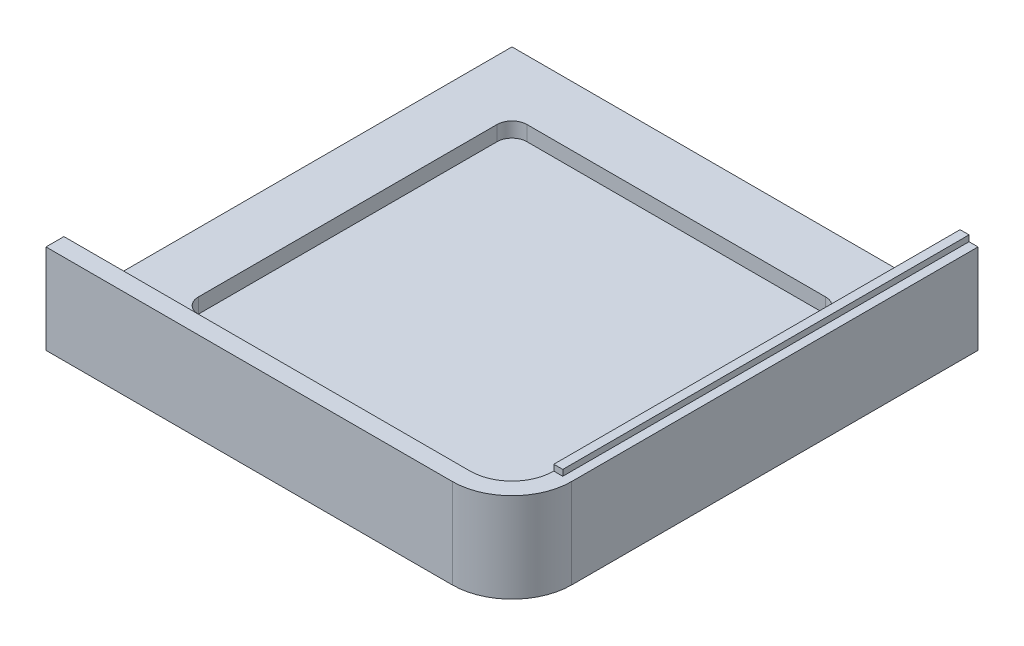
ISO-10303-21;
HEADER;
FILE_DESCRIPTION(('STEP AP214'),'2;1');
FILE_NAME('part.step','',(''),(''),'','','');
FILE_SCHEMA(('AUTOMOTIVE_DESIGN { 1 0 10303 214 1 1 1 1 }'));
ENDSEC;
DATA;
#1=APPLICATION_CONTEXT('core data for automotive mechanical design processes');
#2=APPLICATION_PROTOCOL_DEFINITION('international standard','automotive_design',2000,#1);
#3=PRODUCT_CONTEXT('',#1,'mechanical');
#4=PRODUCT('Part','Part','',(#3));
#5=PRODUCT_RELATED_PRODUCT_CATEGORY('part','',(#4));
#6=PRODUCT_DEFINITION_FORMATION('','',#4);
#7=PRODUCT_DEFINITION_CONTEXT('part definition',#1,'design');
#8=PRODUCT_DEFINITION('design','',#6,#7);
#9=PRODUCT_DEFINITION_SHAPE('','',#8);
#10=(LENGTH_UNIT() NAMED_UNIT(*) SI_UNIT(.MILLI.,.METRE.));
#11=(NAMED_UNIT(*) PLANE_ANGLE_UNIT() SI_UNIT($,.RADIAN.));
#12=(NAMED_UNIT(*) SI_UNIT($,.STERADIAN.) SOLID_ANGLE_UNIT());
#13=UNCERTAINTY_MEASURE_WITH_UNIT(LENGTH_MEASURE(1.E-05),#10,'distance_accuracy_value','');
#14=(GEOMETRIC_REPRESENTATION_CONTEXT(3) GLOBAL_UNCERTAINTY_ASSIGNED_CONTEXT((#13)) GLOBAL_UNIT_ASSIGNED_CONTEXT((#10,
#11,#12)) REPRESENTATION_CONTEXT('',''));
#15=CARTESIAN_POINT('',(0.,0.,0.));
#16=DIRECTION('',(0.,0.,1.));
#17=DIRECTION('',(1.,0.,0.));
#18=AXIS2_PLACEMENT_3D('',#15,#16,#17);
#19=CARTESIAN_POINT('',(0.,5.,0.));
#20=DIRECTION('',(0.,1.,0.));
#21=DIRECTION('',(0.,0.,1.));
#22=AXIS2_PLACEMENT_3D('',#19,#20,#21);
#23=PLANE('',#22);
#24=DIRECTION('',(-1.,0.,0.));
#25=VECTOR('',#24,1.);
#26=CARTESIAN_POINT('',(150.,5.,-6.00000000000002));
#27=LINE('',#26,#25);
#28=CARTESIAN_POINT('',(136.,5.,-6.00000000000002));
#29=VERTEX_POINT('',#28);
#30=CARTESIAN_POINT('',(0.,5.,-6.00000000000001));
#31=VERTEX_POINT('',#30);
#32=EDGE_CURVE('E211',#29,#31,#27,.T.);
#33=ORIENTED_EDGE('',*,*,#32,.F.);
#34=CARTESIAN_POINT('',(136.,5.,-20.));
#35=DIRECTION('',(0.,1.,0.));
#36=DIRECTION('',(0.,0.,1.));
#37=AXIS2_PLACEMENT_3D('',#34,#35,#36);
#38=CIRCLE('',#37,14.);
#39=CARTESIAN_POINT('',(150.,5.,-20.));
#40=VERTEX_POINT('',#39);
#41=EDGE_CURVE('E236',#29,#40,#38,.T.);
#42=ORIENTED_EDGE('',*,*,#41,.T.);
#43=DIRECTION('',(0.,0.,1.));
#44=VECTOR('',#43,1.);
#45=CARTESIAN_POINT('',(150.,5.,-156.));
#46=LINE('',#45,#44);
#47=CARTESIAN_POINT('',(150.,5.,-156.));
#48=VERTEX_POINT('',#47);
#49=EDGE_CURVE('E209',#48,#40,#46,.T.);
#50=ORIENTED_EDGE('',*,*,#49,.F.);
#51=DIRECTION('',(-1.,0.,0.));
#52=VECTOR('',#51,1.);
#53=CARTESIAN_POINT('',(0.,5.,-156.));
#54=LINE('',#53,#52);
#55=CARTESIAN_POINT('',(0.,5.,-156.));
#56=VERTEX_POINT('',#55);
#57=EDGE_CURVE('E173',#48,#56,#54,.T.);
#58=ORIENTED_EDGE('',*,*,#57,.T.);
#59=DIRECTION('',(0.,0.,1.));
#60=VECTOR('',#59,1.);
#61=CARTESIAN_POINT('',(0.,5.,-156.));
#62=LINE('',#61,#60);
#63=EDGE_CURVE('E284',#56,#31,#62,.T.);
#64=ORIENTED_EDGE('',*,*,#63,.T.);
#65=EDGE_LOOP('',(#33,#42,#50,#58,#64));
#66=FACE_BOUND('',#65,.T.);
#67=DIRECTION('',(1.,0.,0.));
#68=VECTOR('',#67,1.);
#69=CARTESIAN_POINT('',(20.,5.,-26.));
#70=LINE('',#69,#68);
#71=CARTESIAN_POINT('',(25.,5.,-26.));
#72=VERTEX_POINT('',#71);
#73=CARTESIAN_POINT('',(125.,5.,-26.));
#74=VERTEX_POINT('',#73);
#75=EDGE_CURVE('E360',#72,#74,#70,.T.);
#76=ORIENTED_EDGE('',*,*,#75,.F.);
#77=CARTESIAN_POINT('',(25.,5.,-31.));
#78=DIRECTION('',(0.,1.,0.));
#79=DIRECTION('',(0.,0.,1.));
#80=AXIS2_PLACEMENT_3D('',#77,#78,#79);
#81=CIRCLE('',#80,5.);
#82=CARTESIAN_POINT('',(20.,5.,-31.));
#83=VERTEX_POINT('',#82);
#84=EDGE_CURVE('E323',#72,#83,#81,.F.);
#85=ORIENTED_EDGE('',*,*,#84,.T.);
#86=DIRECTION('',(0.,0.,1.));
#87=VECTOR('',#86,1.);
#88=CARTESIAN_POINT('',(20.,5.,-136.));
#89=LINE('',#88,#87);
#90=CARTESIAN_POINT('',(20.,5.,-131.));
#91=VERTEX_POINT('',#90);
#92=EDGE_CURVE('E341',#91,#83,#89,.T.);
#93=ORIENTED_EDGE('',*,*,#92,.F.);
#94=CARTESIAN_POINT('',(25.,5.,-131.));
#95=DIRECTION('',(0.,1.,0.));
#96=DIRECTION('',(0.,0.,1.));
#97=AXIS2_PLACEMENT_3D('',#94,#95,#96);
#98=CIRCLE('',#97,5.);
#99=CARTESIAN_POINT('',(25.,5.,-136.));
#100=VERTEX_POINT('',#99);
#101=EDGE_CURVE('E274',#91,#100,#98,.F.);
#102=ORIENTED_EDGE('',*,*,#101,.T.);
#103=DIRECTION('',(-1.,0.,0.));
#104=VECTOR('',#103,1.);
#105=CARTESIAN_POINT('',(20.,5.,-136.));
#106=LINE('',#105,#104);
#107=CARTESIAN_POINT('',(125.,5.,-136.));
#108=VERTEX_POINT('',#107);
#109=EDGE_CURVE('E338',#108,#100,#106,.T.);
#110=ORIENTED_EDGE('',*,*,#109,.F.);
#111=CARTESIAN_POINT('',(125.,5.,-131.));
#112=DIRECTION('',(0.,1.,0.));
#113=DIRECTION('',(0.,0.,1.));
#114=AXIS2_PLACEMENT_3D('',#111,#112,#113);
#115=CIRCLE('',#114,5.);
#116=CARTESIAN_POINT('',(130.,5.,-131.));
#117=VERTEX_POINT('',#116);
#118=EDGE_CURVE('E328',#108,#117,#115,.F.);
#119=ORIENTED_EDGE('',*,*,#118,.T.);
#120=DIRECTION('',(0.,0.,-1.));
#121=VECTOR('',#120,1.);
#122=CARTESIAN_POINT('',(130.,5.,-136.));
#123=LINE('',#122,#121);
#124=CARTESIAN_POINT('',(130.,5.,-31.));
#125=VERTEX_POINT('',#124);
#126=EDGE_CURVE('E348',#125,#117,#123,.T.);
#127=ORIENTED_EDGE('',*,*,#126,.F.);
#128=CARTESIAN_POINT('',(125.,5.,-31.));
#129=DIRECTION('',(0.,1.,0.));
#130=DIRECTION('',(0.,0.,1.));
#131=AXIS2_PLACEMENT_3D('',#128,#129,#130);
#132=CIRCLE('',#131,5.);
#133=EDGE_CURVE('E318',#125,#74,#132,.F.);
#134=ORIENTED_EDGE('',*,*,#133,.T.);
#135=EDGE_LOOP('',(#76,#85,#93,#102,#110,#119,#127,#134));
#136=FACE_BOUND('',#135,.T.);
#137=ADVANCED_FACE('F31',(#66,#136),#23,.T.);
#138=CARTESIAN_POINT('',(0.,5.,-156.));
#139=DIRECTION('',(1.,0.,0.));
#140=DIRECTION('',(0.,0.,-1.));
#141=AXIS2_PLACEMENT_3D('',#138,#139,#140);
#142=PLANE('',#141);
#143=DIRECTION('',(0.,-1.,0.));
#144=VECTOR('',#143,1.);
#145=CARTESIAN_POINT('',(0.,5.,-156.));
#146=LINE('',#145,#144);
#147=CARTESIAN_POINT('',(0.,-5.,-156.));
#148=VERTEX_POINT('',#147);
#149=EDGE_CURVE('E283',#56,#148,#146,.T.);
#150=ORIENTED_EDGE('',*,*,#149,.T.);
#151=DIRECTION('',(0.,0.,-1.));
#152=VECTOR('',#151,1.);
#153=CARTESIAN_POINT('',(0.,-5.,0.));
#154=LINE('',#153,#152);
#155=CARTESIAN_POINT('',(0.,-5.,0.));
#156=VERTEX_POINT('',#155);
#157=EDGE_CURVE('E176',#156,#148,#154,.T.);
#158=ORIENTED_EDGE('',*,*,#157,.F.);
#159=DIRECTION('',(0.,-1.,0.));
#160=VECTOR('',#159,1.);
#161=CARTESIAN_POINT('',(0.,5.,0.));
#162=LINE('',#161,#160);
#163=CARTESIAN_POINT('',(0.,25.,0.));
#164=VERTEX_POINT('',#163);
#165=EDGE_CURVE('E257',#164,#156,#162,.T.);
#166=ORIENTED_EDGE('',*,*,#165,.F.);
#167=DIRECTION('',(0.,0.,1.));
#168=VECTOR('',#167,1.);
#169=CARTESIAN_POINT('',(0.,25.,-6.00000000000001));
#170=LINE('',#169,#168);
#171=CARTESIAN_POINT('',(0.,25.,-6.00000000000001));
#172=VERTEX_POINT('',#171);
#173=EDGE_CURVE('E214',#172,#164,#170,.T.);
#174=ORIENTED_EDGE('',*,*,#173,.F.);
#175=DIRECTION('',(0.,-1.,0.));
#176=VECTOR('',#175,1.);
#177=CARTESIAN_POINT('',(0.,25.,-6.00000000000001));
#178=LINE('',#177,#176);
#179=EDGE_CURVE('E177',#172,#31,#178,.T.);
#180=ORIENTED_EDGE('',*,*,#179,.T.);
#181=ORIENTED_EDGE('',*,*,#63,.F.);
#182=EDGE_LOOP('',(#150,#158,#166,#174,#180,#181));
#183=FACE_BOUND('',#182,.T.);
#184=ADVANCED_FACE('F254',(#183),#142,.F.);
#185=CARTESIAN_POINT('',(0.,5.,0.));
#186=DIRECTION('',(0.,0.,-1.));
#187=DIRECTION('',(-1.,0.,0.));
#188=AXIS2_PLACEMENT_3D('',#185,#186,#187);
#189=PLANE('',#188);
#190=DIRECTION('',(-1.,0.,0.));
#191=VECTOR('',#190,1.);
#192=CARTESIAN_POINT('',(0.,-5.,0.));
#193=LINE('',#192,#191);
#194=CARTESIAN_POINT('',(136.,-5.,0.));
#195=VERTEX_POINT('',#194);
#196=EDGE_CURVE('E366',#195,#156,#193,.T.);
#197=ORIENTED_EDGE('',*,*,#196,.F.);
#198=DIRECTION('',(0.,-1.,0.));
#199=VECTOR('',#198,1.);
#200=CARTESIAN_POINT('',(136.,5.,0.));
#201=LINE('',#200,#199);
#202=CARTESIAN_POINT('',(136.,25.,0.));
#203=VERTEX_POINT('',#202);
#204=EDGE_CURVE('E266',#195,#203,#201,.F.);
#205=ORIENTED_EDGE('',*,*,#204,.T.);
#206=DIRECTION('',(1.,0.,0.));
#207=VECTOR('',#206,1.);
#208=CARTESIAN_POINT('',(0.,25.,0.));
#209=LINE('',#208,#207);
#210=EDGE_CURVE('E217',#164,#203,#209,.T.);
#211=ORIENTED_EDGE('',*,*,#210,.F.);
#212=ORIENTED_EDGE('',*,*,#165,.T.);
#213=EDGE_LOOP('',(#197,#205,#211,#212));
#214=FACE_BOUND('',#213,.T.);
#215=ADVANCED_FACE('F385',(#214),#189,.F.);
#216=CARTESIAN_POINT('',(156.,5.,-156.));
#217=DIRECTION('',(-1.,0.,0.));
#218=DIRECTION('',(0.,0.,1.));
#219=AXIS2_PLACEMENT_3D('',#216,#217,#218);
#220=PLANE('',#219);
#221=DIRECTION('',(0.,0.,-1.));
#222=VECTOR('',#221,1.);
#223=CARTESIAN_POINT('',(156.,25.,0.));
#224=LINE('',#223,#222);
#225=CARTESIAN_POINT('',(156.,25.,-20.));
#226=VERTEX_POINT('',#225);
#227=CARTESIAN_POINT('',(156.,25.,-156.));
#228=VERTEX_POINT('',#227);
#229=EDGE_CURVE('E220',#226,#228,#224,.T.);
#230=ORIENTED_EDGE('',*,*,#229,.F.);
#231=DIRECTION('',(0.,-1.,0.));
#232=VECTOR('',#231,1.);
#233=CARTESIAN_POINT('',(156.,5.,-20.));
#234=LINE('',#233,#232);
#235=CARTESIAN_POINT('',(156.,-5.,-20.));
#236=VERTEX_POINT('',#235);
#237=EDGE_CURVE('E268',#226,#236,#234,.T.);
#238=ORIENTED_EDGE('',*,*,#237,.T.);
#239=DIRECTION('',(0.,0.,1.));
#240=VECTOR('',#239,1.);
#241=CARTESIAN_POINT('',(156.,-5.,0.));
#242=LINE('',#241,#240);
#243=CARTESIAN_POINT('',(156.,-5.,-156.));
#244=VERTEX_POINT('',#243);
#245=EDGE_CURVE('E373',#244,#236,#242,.T.);
#246=ORIENTED_EDGE('',*,*,#245,.F.);
#247=DIRECTION('',(0.,-1.,0.));
#248=VECTOR('',#247,1.);
#249=CARTESIAN_POINT('',(156.,5.,-156.));
#250=LINE('',#249,#248);
#251=EDGE_CURVE('E292',#228,#244,#250,.T.);
#252=ORIENTED_EDGE('',*,*,#251,.F.);
#253=EDGE_LOOP('',(#230,#238,#246,#252));
#254=FACE_BOUND('',#253,.T.);
#255=ADVANCED_FACE('F384',(#254),#220,.F.);
#256=CARTESIAN_POINT('',(0.,5.,-156.));
#257=DIRECTION('',(0.,0.,1.));
#258=DIRECTION('',(1.,0.,0.));
#259=AXIS2_PLACEMENT_3D('',#256,#257,#258);
#260=PLANE('',#259);
#261=ORIENTED_EDGE('',*,*,#251,.T.);
#262=DIRECTION('',(1.,0.,0.));
#263=VECTOR('',#262,1.);
#264=CARTESIAN_POINT('',(0.,-5.,-156.));
#265=LINE('',#264,#263);
#266=EDGE_CURVE('E375',#148,#244,#265,.T.);
#267=ORIENTED_EDGE('',*,*,#266,.F.);
#268=ORIENTED_EDGE('',*,*,#149,.F.);
#269=ORIENTED_EDGE('',*,*,#57,.F.);
#270=DIRECTION('',(0.,-1.,0.));
#271=VECTOR('',#270,1.);
#272=CARTESIAN_POINT('',(150.,25.,-156.));
#273=LINE('',#272,#271);
#274=CARTESIAN_POINT('',(150.,27.,-156.));
#275=VERTEX_POINT('',#274);
#276=EDGE_CURVE('E166',#275,#48,#273,.T.);
#277=ORIENTED_EDGE('',*,*,#276,.F.);
#278=DIRECTION('',(-1.,0.,0.));
#279=VECTOR('',#278,1.);
#280=CARTESIAN_POINT('',(150.,27.,-156.));
#281=LINE('',#280,#279);
#282=CARTESIAN_POINT('',(153.,27.,-156.));
#283=VERTEX_POINT('',#282);
#284=EDGE_CURVE('E171',#283,#275,#281,.T.);
#285=ORIENTED_EDGE('',*,*,#284,.F.);
#286=DIRECTION('',(0.,-1.,0.));
#287=VECTOR('',#286,1.);
#288=CARTESIAN_POINT('',(153.,27.,-156.));
#289=LINE('',#288,#287);
#290=CARTESIAN_POINT('',(153.,25.,-156.));
#291=VERTEX_POINT('',#290);
#292=EDGE_CURVE('E198',#283,#291,#289,.T.);
#293=ORIENTED_EDGE('',*,*,#292,.T.);
#294=DIRECTION('',(-1.,0.,0.));
#295=VECTOR('',#294,1.);
#296=CARTESIAN_POINT('',(156.,25.,-156.));
#297=LINE('',#296,#295);
#298=EDGE_CURVE('E48',#228,#291,#297,.T.);
#299=ORIENTED_EDGE('',*,*,#298,.F.);
#300=EDGE_LOOP('',(#261,#267,#268,#269,#277,#285,#293,#299));
#301=FACE_BOUND('',#300,.T.);
#302=ADVANCED_FACE('F168',(#301),#260,.F.);
#303=CARTESIAN_POINT('',(20.,5.,-136.));
#304=DIRECTION('',(1.,0.,0.));
#305=DIRECTION('',(0.,0.,-1.));
#306=AXIS2_PLACEMENT_3D('',#303,#304,#305);
#307=PLANE('',#306);
#308=ORIENTED_EDGE('',*,*,#92,.T.);
#309=DIRECTION('',(0.,-1.,0.));
#310=VECTOR('',#309,1.);
#311=CARTESIAN_POINT('',(20.,0.,-31.));
#312=LINE('',#311,#310);
#313=CARTESIAN_POINT('',(20.,0.,-31.));
#314=VERTEX_POINT('',#313);
#315=EDGE_CURVE('E307',#83,#314,#312,.T.);
#316=ORIENTED_EDGE('',*,*,#315,.T.);
#317=DIRECTION('',(0.,0.,1.));
#318=VECTOR('',#317,1.);
#319=CARTESIAN_POINT('',(20.,0.,-136.));
#320=LINE('',#319,#318);
#321=CARTESIAN_POINT('',(20.,0.,-131.));
#322=VERTEX_POINT('',#321);
#323=EDGE_CURVE('E356',#322,#314,#320,.T.);
#324=ORIENTED_EDGE('',*,*,#323,.F.);
#325=DIRECTION('',(0.,-1.,0.));
#326=VECTOR('',#325,1.);
#327=CARTESIAN_POINT('',(20.,5.,-131.));
#328=LINE('',#327,#326);
#329=EDGE_CURVE('E305',#322,#91,#328,.F.);
#330=ORIENTED_EDGE('',*,*,#329,.T.);
#331=EDGE_LOOP('',(#308,#316,#324,#330));
#332=FACE_BOUND('',#331,.T.);
#333=ADVANCED_FACE('F401',(#332),#307,.T.);
#334=CARTESIAN_POINT('',(20.,5.,-26.));
#335=DIRECTION('',(0.,0.,-1.));
#336=DIRECTION('',(-1.,0.,0.));
#337=AXIS2_PLACEMENT_3D('',#334,#335,#336);
#338=PLANE('',#337);
#339=ORIENTED_EDGE('',*,*,#75,.T.);
#340=DIRECTION('',(0.,-1.,0.));
#341=VECTOR('',#340,1.);
#342=CARTESIAN_POINT('',(125.,0.,-26.));
#343=LINE('',#342,#341);
#344=CARTESIAN_POINT('',(125.,0.,-26.));
#345=VERTEX_POINT('',#344);
#346=EDGE_CURVE('E297',#74,#345,#343,.T.);
#347=ORIENTED_EDGE('',*,*,#346,.T.);
#348=DIRECTION('',(1.,0.,0.));
#349=VECTOR('',#348,1.);
#350=CARTESIAN_POINT('',(20.,0.,-26.));
#351=LINE('',#350,#349);
#352=CARTESIAN_POINT('',(25.,0.,-26.));
#353=VERTEX_POINT('',#352);
#354=EDGE_CURVE('E362',#353,#345,#351,.T.);
#355=ORIENTED_EDGE('',*,*,#354,.F.);
#356=DIRECTION('',(0.,-1.,0.));
#357=VECTOR('',#356,1.);
#358=CARTESIAN_POINT('',(25.,5.,-26.));
#359=LINE('',#358,#357);
#360=EDGE_CURVE('E295',#353,#72,#359,.F.);
#361=ORIENTED_EDGE('',*,*,#360,.T.);
#362=EDGE_LOOP('',(#339,#347,#355,#361));
#363=FACE_BOUND('',#362,.T.);
#364=ADVANCED_FACE('F407',(#363),#338,.T.);
#365=CARTESIAN_POINT('',(130.,5.,-136.));
#366=DIRECTION('',(-1.,0.,0.));
#367=DIRECTION('',(0.,0.,1.));
#368=AXIS2_PLACEMENT_3D('',#365,#366,#367);
#369=PLANE('',#368);
#370=DIRECTION('',(0.,0.,-1.));
#371=VECTOR('',#370,1.);
#372=CARTESIAN_POINT('',(130.,0.,-136.));
#373=LINE('',#372,#371);
#374=CARTESIAN_POINT('',(130.,0.,-31.));
#375=VERTEX_POINT('',#374);
#376=CARTESIAN_POINT('',(130.,0.,-131.));
#377=VERTEX_POINT('',#376);
#378=EDGE_CURVE('E359',#375,#377,#373,.T.);
#379=ORIENTED_EDGE('',*,*,#378,.F.);
#380=DIRECTION('',(0.,-1.,0.));
#381=VECTOR('',#380,1.);
#382=CARTESIAN_POINT('',(130.,5.,-31.));
#383=LINE('',#382,#381);
#384=EDGE_CURVE('E303',#375,#125,#383,.F.);
#385=ORIENTED_EDGE('',*,*,#384,.T.);
#386=ORIENTED_EDGE('',*,*,#126,.T.);
#387=DIRECTION('',(0.,-1.,0.));
#388=VECTOR('',#387,1.);
#389=CARTESIAN_POINT('',(130.,0.,-131.));
#390=LINE('',#389,#388);
#391=EDGE_CURVE('E300',#117,#377,#390,.T.);
#392=ORIENTED_EDGE('',*,*,#391,.T.);
#393=EDGE_LOOP('',(#379,#385,#386,#392));
#394=FACE_BOUND('',#393,.T.);
#395=ADVANCED_FACE('F412',(#394),#369,.T.);
#396=CARTESIAN_POINT('',(20.,5.,-136.));
#397=DIRECTION('',(0.,0.,1.));
#398=DIRECTION('',(1.,0.,0.));
#399=AXIS2_PLACEMENT_3D('',#396,#397,#398);
#400=PLANE('',#399);
#401=DIRECTION('',(-1.,0.,0.));
#402=VECTOR('',#401,1.);
#403=CARTESIAN_POINT('',(20.,0.,-136.));
#404=LINE('',#403,#402);
#405=CARTESIAN_POINT('',(125.,0.,-136.));
#406=VERTEX_POINT('',#405);
#407=CARTESIAN_POINT('',(25.,0.,-136.));
#408=VERTEX_POINT('',#407);
#409=EDGE_CURVE('E357',#406,#408,#404,.T.);
#410=ORIENTED_EDGE('',*,*,#409,.F.);
#411=DIRECTION('',(0.,-1.,0.));
#412=VECTOR('',#411,1.);
#413=CARTESIAN_POINT('',(125.,5.,-136.));
#414=LINE('',#413,#412);
#415=EDGE_CURVE('E313',#406,#108,#414,.F.);
#416=ORIENTED_EDGE('',*,*,#415,.T.);
#417=ORIENTED_EDGE('',*,*,#109,.T.);
#418=DIRECTION('',(0.,-1.,0.));
#419=VECTOR('',#418,1.);
#420=CARTESIAN_POINT('',(25.,0.,-136.));
#421=LINE('',#420,#419);
#422=EDGE_CURVE('E310',#100,#408,#421,.T.);
#423=ORIENTED_EDGE('',*,*,#422,.T.);
#424=EDGE_LOOP('',(#410,#416,#417,#423));
#425=FACE_BOUND('',#424,.T.);
#426=ADVANCED_FACE('F345',(#425),#400,.T.);
#427=CARTESIAN_POINT('',(125.,5.,-31.));
#428=DIRECTION('',(0.,1.,0.));
#429=DIRECTION('',(0.,0.,1.));
#430=AXIS2_PLACEMENT_3D('',#427,#428,#429);
#431=CYLINDRICAL_SURFACE('',#430,5.);
#432=ORIENTED_EDGE('',*,*,#133,.F.);
#433=ORIENTED_EDGE('',*,*,#384,.F.);
#434=CARTESIAN_POINT('',(125.,0.,-31.));
#435=DIRECTION('',(0.,1.,0.));
#436=DIRECTION('',(0.,0.,1.));
#437=AXIS2_PLACEMENT_3D('',#434,#435,#436);
#438=CIRCLE('',#437,5.);
#439=EDGE_CURVE('E315',#345,#375,#438,.T.);
#440=ORIENTED_EDGE('',*,*,#439,.F.);
#441=ORIENTED_EDGE('',*,*,#346,.F.);
#442=EDGE_LOOP('',(#432,#433,#440,#441));
#443=FACE_BOUND('',#442,.T.);
#444=ADVANCED_FACE('F422',(#443),#431,.F.);
#445=CARTESIAN_POINT('',(25.,5.,-31.));
#446=DIRECTION('',(0.,1.,0.));
#447=DIRECTION('',(0.,0.,1.));
#448=AXIS2_PLACEMENT_3D('',#445,#446,#447);
#449=CYLINDRICAL_SURFACE('',#448,5.);
#450=ORIENTED_EDGE('',*,*,#84,.F.);
#451=ORIENTED_EDGE('',*,*,#360,.F.);
#452=CARTESIAN_POINT('',(25.,0.,-31.));
#453=DIRECTION('',(0.,1.,0.));
#454=DIRECTION('',(0.,0.,1.));
#455=AXIS2_PLACEMENT_3D('',#452,#453,#454);
#456=CIRCLE('',#455,5.);
#457=EDGE_CURVE('E320',#314,#353,#456,.T.);
#458=ORIENTED_EDGE('',*,*,#457,.F.);
#459=ORIENTED_EDGE('',*,*,#315,.F.);
#460=EDGE_LOOP('',(#450,#451,#458,#459));
#461=FACE_BOUND('',#460,.T.);
#462=ADVANCED_FACE('F417',(#461),#449,.F.);
#463=CARTESIAN_POINT('',(125.,5.,-131.));
#464=DIRECTION('',(0.,1.,0.));
#465=DIRECTION('',(0.,0.,1.));
#466=AXIS2_PLACEMENT_3D('',#463,#464,#465);
#467=CYLINDRICAL_SURFACE('',#466,5.);
#468=ORIENTED_EDGE('',*,*,#118,.F.);
#469=ORIENTED_EDGE('',*,*,#415,.F.);
#470=CARTESIAN_POINT('',(125.,0.,-131.));
#471=DIRECTION('',(0.,1.,0.));
#472=DIRECTION('',(0.,0.,1.));
#473=AXIS2_PLACEMENT_3D('',#470,#471,#472);
#474=CIRCLE('',#473,5.);
#475=EDGE_CURVE('E325',#377,#406,#474,.T.);
#476=ORIENTED_EDGE('',*,*,#475,.F.);
#477=ORIENTED_EDGE('',*,*,#391,.F.);
#478=EDGE_LOOP('',(#468,#469,#476,#477));
#479=FACE_BOUND('',#478,.T.);
#480=ADVANCED_FACE('F428',(#479),#467,.F.);
#481=CARTESIAN_POINT('',(25.,5.,-131.));
#482=DIRECTION('',(0.,1.,0.));
#483=DIRECTION('',(0.,0.,1.));
#484=AXIS2_PLACEMENT_3D('',#481,#482,#483);
#485=CYLINDRICAL_SURFACE('',#484,5.);
#486=ORIENTED_EDGE('',*,*,#101,.F.);
#487=ORIENTED_EDGE('',*,*,#329,.F.);
#488=CARTESIAN_POINT('',(25.,0.,-131.));
#489=DIRECTION('',(0.,1.,0.));
#490=DIRECTION('',(0.,0.,1.));
#491=AXIS2_PLACEMENT_3D('',#488,#489,#490);
#492=CIRCLE('',#491,5.);
#493=EDGE_CURVE('E330',#408,#322,#492,.T.);
#494=ORIENTED_EDGE('',*,*,#493,.F.);
#495=ORIENTED_EDGE('',*,*,#422,.F.);
#496=EDGE_LOOP('',(#486,#487,#494,#495));
#497=FACE_BOUND('',#496,.T.);
#498=ADVANCED_FACE('F350',(#497),#485,.F.);
#499=CARTESIAN_POINT('',(0.,0.,-156.));
#500=DIRECTION('',(0.,-1.,0.));
#501=DIRECTION('',(0.,0.,-1.));
#502=AXIS2_PLACEMENT_3D('',#499,#500,#501);
#503=PLANE('',#502);
#504=ORIENTED_EDGE('',*,*,#354,.T.);
#505=ORIENTED_EDGE('',*,*,#439,.T.);
#506=ORIENTED_EDGE('',*,*,#378,.T.);
#507=ORIENTED_EDGE('',*,*,#475,.T.);
#508=ORIENTED_EDGE('',*,*,#409,.T.);
#509=ORIENTED_EDGE('',*,*,#493,.T.);
#510=ORIENTED_EDGE('',*,*,#323,.T.);
#511=ORIENTED_EDGE('',*,*,#457,.T.);
#512=EDGE_LOOP('',(#504,#505,#506,#507,#508,#509,#510,#511));
#513=FACE_BOUND('',#512,.T.);
#514=ADVANCED_FACE('F355',(#513),#503,.F.);
#515=CARTESIAN_POINT('',(0.,-5.,-156.));
#516=DIRECTION('',(0.,-1.,0.));
#517=DIRECTION('',(0.,0.,-1.));
#518=AXIS2_PLACEMENT_3D('',#515,#516,#517);
#519=PLANE('',#518);
#520=ORIENTED_EDGE('',*,*,#245,.T.);
#521=CARTESIAN_POINT('',(136.,-5.,-20.));
#522=DIRECTION('',(0.,-1.,0.));
#523=DIRECTION('',(0.,0.,-1.));
#524=AXIS2_PLACEMENT_3D('',#521,#522,#523);
#525=CIRCLE('',#524,20.);
#526=EDGE_CURVE('E269',#236,#195,#525,.T.);
#527=ORIENTED_EDGE('',*,*,#526,.T.);
#528=ORIENTED_EDGE('',*,*,#196,.T.);
#529=ORIENTED_EDGE('',*,*,#157,.T.);
#530=ORIENTED_EDGE('',*,*,#266,.T.);
#531=EDGE_LOOP('',(#520,#527,#528,#529,#530));
#532=FACE_BOUND('',#531,.T.);
#533=ADVANCED_FACE('F381',(#532),#519,.T.);
#534=CARTESIAN_POINT('',(150.,25.,-156.));
#535=DIRECTION('',(1.,0.,0.));
#536=DIRECTION('',(0.,0.,-1.));
#537=AXIS2_PLACEMENT_3D('',#534,#535,#536);
#538=PLANE('',#537);
#539=ORIENTED_EDGE('',*,*,#49,.T.);
#540=DIRECTION('',(0.,-1.,0.));
#541=VECTOR('',#540,1.);
#542=CARTESIAN_POINT('',(150.,25.,-20.));
#543=LINE('',#542,#541);
#544=CARTESIAN_POINT('',(150.,25.,-20.));
#545=VERTEX_POINT('',#544);
#546=EDGE_CURVE('E40',#40,#545,#543,.F.);
#547=ORIENTED_EDGE('',*,*,#546,.T.);
#548=DIRECTION('',(0.,-1.,0.));
#549=VECTOR('',#548,1.);
#550=CARTESIAN_POINT('',(150.,27.,-20.));
#551=LINE('',#550,#549);
#552=CARTESIAN_POINT('',(150.,27.,-20.));
#553=VERTEX_POINT('',#552);
#554=EDGE_CURVE('E183',#553,#545,#551,.T.);
#555=ORIENTED_EDGE('',*,*,#554,.F.);
#556=DIRECTION('',(0.,0.,1.));
#557=VECTOR('',#556,1.);
#558=CARTESIAN_POINT('',(150.,27.,-156.));
#559=LINE('',#558,#557);
#560=EDGE_CURVE('E180',#275,#553,#559,.T.);
#561=ORIENTED_EDGE('',*,*,#560,.F.);
#562=ORIENTED_EDGE('',*,*,#276,.T.);
#563=EDGE_LOOP('',(#539,#547,#555,#561,#562));
#564=FACE_BOUND('',#563,.T.);
#565=ADVANCED_FACE('F181',(#564),#538,.F.);
#566=CARTESIAN_POINT('',(150.,25.,-6.00000000000002));
#567=DIRECTION('',(0.,0.,1.));
#568=DIRECTION('',(1.,0.,0.));
#569=AXIS2_PLACEMENT_3D('',#566,#567,#568);
#570=PLANE('',#569);
#571=DIRECTION('',(-1.,0.,0.));
#572=VECTOR('',#571,1.);
#573=CARTESIAN_POINT('',(150.,25.,-6.00000000000002));
#574=LINE('',#573,#572);
#575=CARTESIAN_POINT('',(136.,25.,-6.00000000000002));
#576=VERTEX_POINT('',#575);
#577=EDGE_CURVE('E223',#576,#172,#574,.T.);
#578=ORIENTED_EDGE('',*,*,#577,.F.);
#579=DIRECTION('',(0.,-1.,0.));
#580=VECTOR('',#579,1.);
#581=CARTESIAN_POINT('',(136.,5.,-6.00000000000002));
#582=LINE('',#581,#580);
#583=EDGE_CURVE('E233',#576,#29,#582,.T.);
#584=ORIENTED_EDGE('',*,*,#583,.T.);
#585=ORIENTED_EDGE('',*,*,#32,.T.);
#586=ORIENTED_EDGE('',*,*,#179,.F.);
#587=EDGE_LOOP('',(#578,#584,#585,#586));
#588=FACE_BOUND('',#587,.T.);
#589=ADVANCED_FACE('F246',(#588),#570,.F.);
#590=CARTESIAN_POINT('',(0.,25.,0.));
#591=DIRECTION('',(0.,1.,0.));
#592=DIRECTION('',(0.,0.,1.));
#593=AXIS2_PLACEMENT_3D('',#590,#591,#592);
#594=PLANE('',#593);
#595=DIRECTION('',(0.,0.,-1.));
#596=VECTOR('',#595,1.);
#597=CARTESIAN_POINT('',(153.,25.,-156.));
#598=LINE('',#597,#596);
#599=CARTESIAN_POINT('',(153.,25.,-20.));
#600=VERTEX_POINT('',#599);
#601=EDGE_CURVE('E192',#600,#291,#598,.T.);
#602=ORIENTED_EDGE('',*,*,#601,.F.);
#603=DIRECTION('',(1.,0.,0.));
#604=VECTOR('',#603,1.);
#605=CARTESIAN_POINT('',(150.,25.,-20.));
#606=LINE('',#605,#604);
#607=EDGE_CURVE('E53',#545,#600,#606,.T.);
#608=ORIENTED_EDGE('',*,*,#607,.F.);
#609=CARTESIAN_POINT('',(136.,25.,-20.));
#610=DIRECTION('',(0.,1.,0.));
#611=DIRECTION('',(0.,0.,1.));
#612=AXIS2_PLACEMENT_3D('',#609,#610,#611);
#613=CIRCLE('',#612,14.);
#614=EDGE_CURVE('E11',#545,#576,#613,.F.);
#615=ORIENTED_EDGE('',*,*,#614,.T.);
#616=ORIENTED_EDGE('',*,*,#577,.T.);
#617=ORIENTED_EDGE('',*,*,#173,.T.);
#618=ORIENTED_EDGE('',*,*,#210,.T.);
#619=CARTESIAN_POINT('',(136.,25.,-20.));
#620=DIRECTION('',(0.,1.,0.));
#621=DIRECTION('',(0.,0.,1.));
#622=AXIS2_PLACEMENT_3D('',#619,#620,#621);
#623=CIRCLE('',#622,20.);
#624=EDGE_CURVE('E231',#203,#226,#623,.T.);
#625=ORIENTED_EDGE('',*,*,#624,.T.);
#626=ORIENTED_EDGE('',*,*,#229,.T.);
#627=ORIENTED_EDGE('',*,*,#298,.T.);
#628=EDGE_LOOP('',(#602,#608,#615,#616,#617,#618,#625,#626,#627));
#629=FACE_BOUND('',#628,.T.);
#630=ADVANCED_FACE('F243',(#629),#594,.T.);
#631=CARTESIAN_POINT('',(136.,5.,-20.));
#632=DIRECTION('',(0.,-1.,0.));
#633=DIRECTION('',(0.,0.,-1.));
#634=AXIS2_PLACEMENT_3D('',#631,#632,#633);
#635=CYLINDRICAL_SURFACE('',#634,20.);
#636=ORIENTED_EDGE('',*,*,#624,.F.);
#637=ORIENTED_EDGE('',*,*,#204,.F.);
#638=ORIENTED_EDGE('',*,*,#526,.F.);
#639=ORIENTED_EDGE('',*,*,#237,.F.);
#640=EDGE_LOOP('',(#636,#637,#638,#639));
#641=FACE_BOUND('',#640,.T.);
#642=ADVANCED_FACE('F265',(#641),#635,.T.);
#643=CARTESIAN_POINT('',(136.,25.,-20.));
#644=DIRECTION('',(0.,1.,0.));
#645=DIRECTION('',(0.,0.,1.));
#646=AXIS2_PLACEMENT_3D('',#643,#644,#645);
#647=CYLINDRICAL_SURFACE('',#646,14.);
#648=ORIENTED_EDGE('',*,*,#614,.F.);
#649=ORIENTED_EDGE('',*,*,#546,.F.);
#650=ORIENTED_EDGE('',*,*,#41,.F.);
#651=ORIENTED_EDGE('',*,*,#583,.F.);
#652=EDGE_LOOP('',(#648,#649,#650,#651));
#653=FACE_BOUND('',#652,.T.);
#654=ADVANCED_FACE('F33',(#653),#647,.F.);
#655=CARTESIAN_POINT('',(150.,27.,-20.));
#656=DIRECTION('',(0.,0.,-1.));
#657=DIRECTION('',(-1.,0.,0.));
#658=AXIS2_PLACEMENT_3D('',#655,#656,#657);
#659=PLANE('',#658);
#660=ORIENTED_EDGE('',*,*,#607,.T.);
#661=DIRECTION('',(0.,-1.,0.));
#662=VECTOR('',#661,1.);
#663=CARTESIAN_POINT('',(153.,27.,-20.));
#664=LINE('',#663,#662);
#665=CARTESIAN_POINT('',(153.,27.,-20.));
#666=VERTEX_POINT('',#665);
#667=EDGE_CURVE('E202',#666,#600,#664,.T.);
#668=ORIENTED_EDGE('',*,*,#667,.F.);
#669=DIRECTION('',(1.,0.,0.));
#670=VECTOR('',#669,1.);
#671=CARTESIAN_POINT('',(150.,27.,-20.));
#672=LINE('',#671,#670);
#673=EDGE_CURVE('E186',#553,#666,#672,.T.);
#674=ORIENTED_EDGE('',*,*,#673,.F.);
#675=ORIENTED_EDGE('',*,*,#554,.T.);
#676=EDGE_LOOP('',(#660,#668,#674,#675));
#677=FACE_BOUND('',#676,.T.);
#678=ADVANCED_FACE('F443',(#677),#659,.F.);
#679=CARTESIAN_POINT('',(153.,27.,-156.));
#680=DIRECTION('',(-1.,0.,0.));
#681=DIRECTION('',(0.,0.,1.));
#682=AXIS2_PLACEMENT_3D('',#679,#680,#681);
#683=PLANE('',#682);
#684=ORIENTED_EDGE('',*,*,#601,.T.);
#685=ORIENTED_EDGE('',*,*,#292,.F.);
#686=DIRECTION('',(0.,0.,-1.));
#687=VECTOR('',#686,1.);
#688=CARTESIAN_POINT('',(153.,27.,-156.));
#689=LINE('',#688,#687);
#690=EDGE_CURVE('E190',#666,#283,#689,.T.);
#691=ORIENTED_EDGE('',*,*,#690,.F.);
#692=ORIENTED_EDGE('',*,*,#667,.T.);
#693=EDGE_LOOP('',(#684,#685,#691,#692));
#694=FACE_BOUND('',#693,.T.);
#695=ADVANCED_FACE('F566',(#694),#683,.F.);
#696=CARTESIAN_POINT('',(153.,27.,-156.));
#697=DIRECTION('',(0.,-1.,0.));
#698=DIRECTION('',(0.,0.,-1.));
#699=AXIS2_PLACEMENT_3D('',#696,#697,#698);
#700=PLANE('',#699);
#701=ORIENTED_EDGE('',*,*,#284,.T.);
#702=ORIENTED_EDGE('',*,*,#560,.T.);
#703=ORIENTED_EDGE('',*,*,#673,.T.);
#704=ORIENTED_EDGE('',*,*,#690,.T.);
#705=EDGE_LOOP('',(#701,#702,#703,#704));
#706=FACE_BOUND('',#705,.T.);
#707=ADVANCED_FACE('F188',(#706),#700,.F.);
#708=CLOSED_SHELL('',(#137,#184,#215,#255,#302,#333,#364,#395,#426,#444,#462,#480,#498,#514,
#533,#565,#589,#630,#642,#654,#678,#695,#707));
#709=MANIFOLD_SOLID_BREP('B2',#708);
#710=ADVANCED_BREP_SHAPE_REPRESENTATION('',(#18,#709),#14);
#711=SHAPE_DEFINITION_REPRESENTATION(#9,#710);
ENDSEC;
END-ISO-10303-21;
